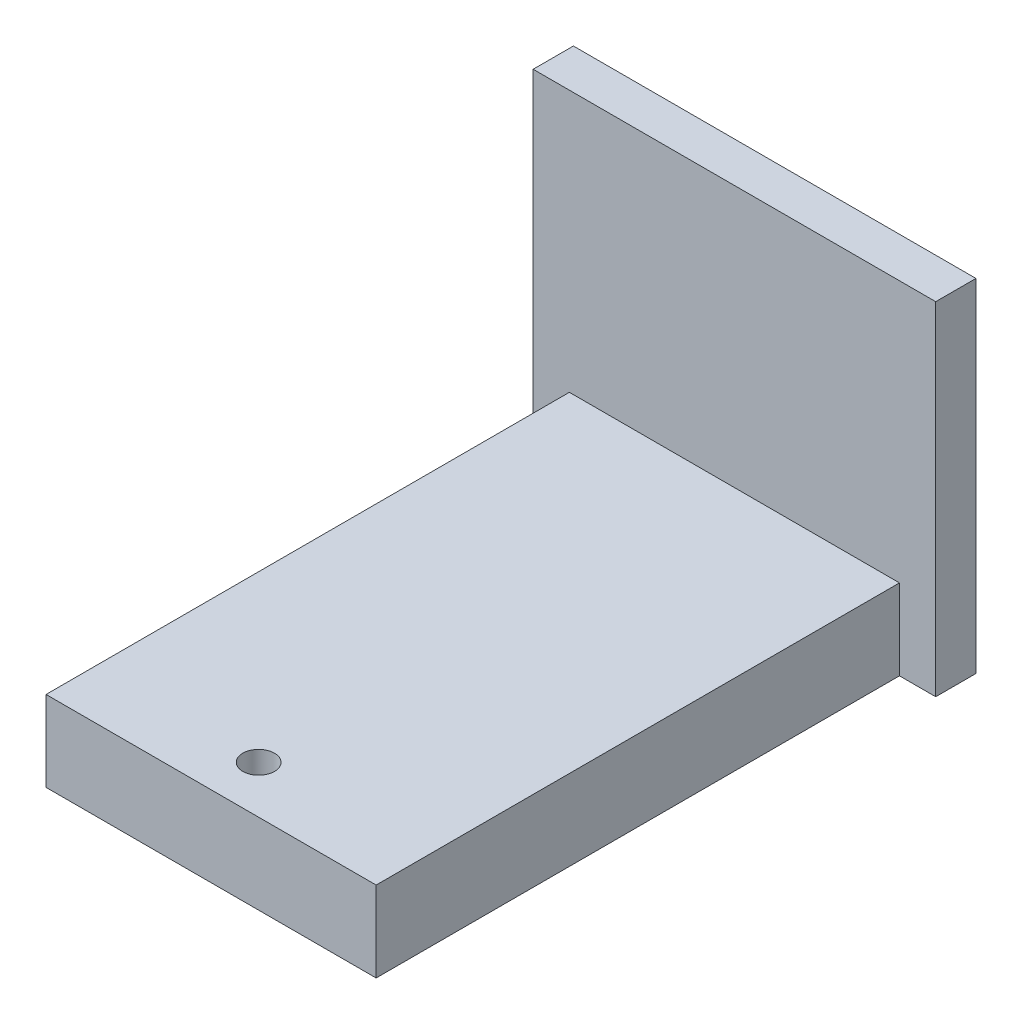
ISO-10303-21;
HEADER;
FILE_DESCRIPTION(('STEP AP214'),'2;1');
FILE_NAME('part.step','',(''),(''),'','','');
FILE_SCHEMA(('AUTOMOTIVE_DESIGN { 1 0 10303 214 1 1 1 1 }'));
ENDSEC;
DATA;
#1=APPLICATION_CONTEXT('core data for automotive mechanical design processes');
#2=APPLICATION_PROTOCOL_DEFINITION('international standard','automotive_design',2000,#1);
#3=PRODUCT_CONTEXT('',#1,'mechanical');
#4=PRODUCT('Part','Part','',(#3));
#5=PRODUCT_RELATED_PRODUCT_CATEGORY('part','',(#4));
#6=PRODUCT_DEFINITION_FORMATION('','',#4);
#7=PRODUCT_DEFINITION_CONTEXT('part definition',#1,'design');
#8=PRODUCT_DEFINITION('design','',#6,#7);
#9=PRODUCT_DEFINITION_SHAPE('','',#8);
#10=(LENGTH_UNIT() NAMED_UNIT(*) SI_UNIT(.MILLI.,.METRE.));
#11=(NAMED_UNIT(*) PLANE_ANGLE_UNIT() SI_UNIT($,.RADIAN.));
#12=(NAMED_UNIT(*) SI_UNIT($,.STERADIAN.) SOLID_ANGLE_UNIT());
#13=UNCERTAINTY_MEASURE_WITH_UNIT(LENGTH_MEASURE(1.E-05),#10,'distance_accuracy_value','');
#14=(GEOMETRIC_REPRESENTATION_CONTEXT(3) GLOBAL_UNCERTAINTY_ASSIGNED_CONTEXT((#13)) GLOBAL_UNIT_ASSIGNED_CONTEXT((#10,
#11,#12)) REPRESENTATION_CONTEXT('',''));
#15=CARTESIAN_POINT('',(0.,0.,0.));
#16=DIRECTION('',(0.,0.,1.));
#17=DIRECTION('',(1.,0.,0.));
#18=AXIS2_PLACEMENT_3D('',#15,#16,#17);
#19=CARTESIAN_POINT('',(0.,0.,2.54));
#20=DIRECTION('',(1.,0.,0.));
#21=DIRECTION('',(0.,1.,0.));
#22=AXIS2_PLACEMENT_3D('',#19,#20,#21);
#23=PLANE('',#22);
#24=DIRECTION('',(0.,-1.,0.));
#25=VECTOR('',#24,1.);
#26=CARTESIAN_POINT('',(0.,0.,0.));
#27=LINE('',#26,#25);
#28=CARTESIAN_POINT('',(0.,0.,0.));
#29=VERTEX_POINT('',#28);
#30=CARTESIAN_POINT('',(0.,-21.59,0.));
#31=VERTEX_POINT('',#30);
#32=EDGE_CURVE('E83',#29,#31,#27,.T.);
#33=ORIENTED_EDGE('',*,*,#32,.T.);
#34=DIRECTION('',(0.,0.,1.));
#35=VECTOR('',#34,1.);
#36=CARTESIAN_POINT('',(0.,-21.59,0.));
#37=LINE('',#36,#35);
#38=CARTESIAN_POINT('',(0.,-21.59,2.54));
#39=VERTEX_POINT('',#38);
#40=EDGE_CURVE('E49',#31,#39,#37,.T.);
#41=ORIENTED_EDGE('',*,*,#40,.T.);
#42=DIRECTION('',(0.,-1.,0.));
#43=VECTOR('',#42,1.);
#44=CARTESIAN_POINT('',(0.,0.,2.54));
#45=LINE('',#44,#43);
#46=CARTESIAN_POINT('',(0.,0.,2.54));
#47=VERTEX_POINT('',#46);
#48=EDGE_CURVE('E78',#47,#39,#45,.T.);
#49=ORIENTED_EDGE('',*,*,#48,.F.);
#50=DIRECTION('',(0.,0.,-1.));
#51=VECTOR('',#50,1.);
#52=CARTESIAN_POINT('',(0.,0.,2.54));
#53=LINE('',#52,#51);
#54=EDGE_CURVE('E42',#47,#29,#53,.T.);
#55=ORIENTED_EDGE('',*,*,#54,.T.);
#56=EDGE_LOOP('',(#33,#41,#49,#55));
#57=FACE_BOUND('',#56,.T.);
#58=ADVANCED_FACE('F35',(#57),#23,.F.);
#59=CARTESIAN_POINT('',(25.4,0.,2.54));
#60=DIRECTION('',(-1.,0.,0.));
#61=DIRECTION('',(0.,-1.,0.));
#62=AXIS2_PLACEMENT_3D('',#59,#60,#61);
#63=PLANE('',#62);
#64=DIRECTION('',(0.,1.,0.));
#65=VECTOR('',#64,1.);
#66=CARTESIAN_POINT('',(25.4,0.,2.54));
#67=LINE('',#66,#65);
#68=CARTESIAN_POINT('',(25.4,-21.59,2.54));
#69=VERTEX_POINT('',#68);
#70=CARTESIAN_POINT('',(25.4,0.,2.54));
#71=VERTEX_POINT('',#70);
#72=EDGE_CURVE('E94',#69,#71,#67,.T.);
#73=ORIENTED_EDGE('',*,*,#72,.F.);
#74=DIRECTION('',(0.,0.,1.));
#75=VECTOR('',#74,1.);
#76=CARTESIAN_POINT('',(25.4,-21.59,0.));
#77=LINE('',#76,#75);
#78=CARTESIAN_POINT('',(25.4,-21.59,0.));
#79=VERTEX_POINT('',#78);
#80=EDGE_CURVE('E130',#79,#69,#77,.T.);
#81=ORIENTED_EDGE('',*,*,#80,.F.);
#82=DIRECTION('',(0.,1.,0.));
#83=VECTOR('',#82,1.);
#84=CARTESIAN_POINT('',(25.4,0.,0.));
#85=LINE('',#84,#83);
#86=CARTESIAN_POINT('',(25.4,0.,0.));
#87=VERTEX_POINT('',#86);
#88=EDGE_CURVE('E79',#79,#87,#85,.T.);
#89=ORIENTED_EDGE('',*,*,#88,.T.);
#90=DIRECTION('',(0.,0.,-1.));
#91=VECTOR('',#90,1.);
#92=CARTESIAN_POINT('',(25.4,0.,2.54));
#93=LINE('',#92,#91);
#94=EDGE_CURVE('E11',#71,#87,#93,.T.);
#95=ORIENTED_EDGE('',*,*,#94,.F.);
#96=EDGE_LOOP('',(#73,#81,#89,#95));
#97=FACE_BOUND('',#96,.T.);
#98=ADVANCED_FACE('F187',(#97),#63,.F.);
#99=CARTESIAN_POINT('',(0.,0.,2.54));
#100=DIRECTION('',(0.,-1.,0.));
#101=DIRECTION('',(0.,0.,-1.));
#102=AXIS2_PLACEMENT_3D('',#99,#100,#101);
#103=PLANE('',#102);
#104=DIRECTION('',(-1.,0.,0.));
#105=VECTOR('',#104,1.);
#106=CARTESIAN_POINT('',(0.,0.,0.));
#107=LINE('',#106,#105);
#108=EDGE_CURVE('E70',#87,#29,#107,.T.);
#109=ORIENTED_EDGE('',*,*,#108,.T.);
#110=ORIENTED_EDGE('',*,*,#54,.F.);
#111=DIRECTION('',(-1.,0.,0.));
#112=VECTOR('',#111,1.);
#113=CARTESIAN_POINT('',(0.,0.,2.54));
#114=LINE('',#113,#112);
#115=EDGE_CURVE('E58',#71,#47,#114,.T.);
#116=ORIENTED_EDGE('',*,*,#115,.F.);
#117=ORIENTED_EDGE('',*,*,#94,.T.);
#118=EDGE_LOOP('',(#109,#110,#116,#117));
#119=FACE_BOUND('',#118,.T.);
#120=ADVANCED_FACE('F72',(#119),#103,.F.);
#121=CARTESIAN_POINT('',(0.,0.,2.54));
#122=DIRECTION('',(0.,0.,1.));
#123=DIRECTION('',(1.,0.,0.));
#124=AXIS2_PLACEMENT_3D('',#121,#122,#123);
#125=PLANE('',#124);
#126=DIRECTION('',(-1.,0.,0.));
#127=VECTOR('',#126,1.);
#128=CARTESIAN_POINT('',(0.,-21.59,2.54));
#129=LINE('',#128,#127);
#130=CARTESIAN_POINT('',(23.114,-21.59,2.54));
#131=VERTEX_POINT('',#130);
#132=EDGE_CURVE('E116',#69,#131,#129,.T.);
#133=ORIENTED_EDGE('',*,*,#132,.F.);
#134=ORIENTED_EDGE('',*,*,#72,.T.);
#135=ORIENTED_EDGE('',*,*,#115,.T.);
#136=ORIENTED_EDGE('',*,*,#48,.T.);
#137=CARTESIAN_POINT('',(2.286,-21.59,2.54));
#138=VERTEX_POINT('',#137);
#139=EDGE_CURVE('E129',#138,#39,#129,.T.);
#140=ORIENTED_EDGE('',*,*,#139,.F.);
#141=DIRECTION('',(0.,-1.,0.));
#142=VECTOR('',#141,1.);
#143=CARTESIAN_POINT('',(2.286,-16.51,2.54));
#144=LINE('',#143,#142);
#145=CARTESIAN_POINT('',(2.286,-16.51,2.54));
#146=VERTEX_POINT('',#145);
#147=EDGE_CURVE('E102',#146,#138,#144,.T.);
#148=ORIENTED_EDGE('',*,*,#147,.F.);
#149=DIRECTION('',(1.,0.,0.));
#150=VECTOR('',#149,1.);
#151=CARTESIAN_POINT('',(0.,-16.51,2.54));
#152=LINE('',#151,#150);
#153=CARTESIAN_POINT('',(23.114,-16.51,2.54));
#154=VERTEX_POINT('',#153);
#155=EDGE_CURVE('E105',#146,#154,#152,.T.);
#156=ORIENTED_EDGE('',*,*,#155,.T.);
#157=DIRECTION('',(0.,-1.,0.));
#158=VECTOR('',#157,1.);
#159=CARTESIAN_POINT('',(23.114,-16.51,2.54));
#160=LINE('',#159,#158);
#161=EDGE_CURVE('E99',#154,#131,#160,.T.);
#162=ORIENTED_EDGE('',*,*,#161,.T.);
#163=EDGE_LOOP('',(#133,#134,#135,#136,#140,#148,#156,#162));
#164=FACE_BOUND('',#163,.T.);
#165=ADVANCED_FACE('F163',(#164),#125,.T.);
#166=CARTESIAN_POINT('',(0.,0.,0.));
#167=DIRECTION('',(0.,0.,1.));
#168=DIRECTION('',(1.,0.,0.));
#169=AXIS2_PLACEMENT_3D('',#166,#167,#168);
#170=PLANE('',#169);
#171=ORIENTED_EDGE('',*,*,#88,.F.);
#172=DIRECTION('',(-1.,0.,0.));
#173=VECTOR('',#172,1.);
#174=CARTESIAN_POINT('',(0.,-21.59,0.));
#175=LINE('',#174,#173);
#176=EDGE_CURVE('E85',#79,#31,#175,.T.);
#177=ORIENTED_EDGE('',*,*,#176,.T.);
#178=ORIENTED_EDGE('',*,*,#32,.F.);
#179=ORIENTED_EDGE('',*,*,#108,.F.);
#180=EDGE_LOOP('',(#171,#177,#178,#179));
#181=FACE_BOUND('',#180,.T.);
#182=ADVANCED_FACE('F84',(#181),#170,.F.);
#183=CARTESIAN_POINT('',(2.286,-16.51,0.));
#184=DIRECTION('',(-1.,0.,0.));
#185=DIRECTION('',(0.,0.,1.));
#186=AXIS2_PLACEMENT_3D('',#183,#184,#185);
#187=PLANE('',#186);
#188=DIRECTION('',(0.,0.,-1.));
#189=VECTOR('',#188,1.);
#190=CARTESIAN_POINT('',(2.286,-21.59,0.));
#191=LINE('',#190,#189);
#192=CARTESIAN_POINT('',(2.286,-21.59,35.56));
#193=VERTEX_POINT('',#192);
#194=EDGE_CURVE('E113',#193,#138,#191,.T.);
#195=ORIENTED_EDGE('',*,*,#194,.F.);
#196=DIRECTION('',(0.,-1.,0.));
#197=VECTOR('',#196,1.);
#198=CARTESIAN_POINT('',(2.286,-16.51,35.56));
#199=LINE('',#198,#197);
#200=CARTESIAN_POINT('',(2.286,-16.51,35.56));
#201=VERTEX_POINT('',#200);
#202=EDGE_CURVE('E86',#201,#193,#199,.T.);
#203=ORIENTED_EDGE('',*,*,#202,.F.);
#204=DIRECTION('',(0.,0.,-1.));
#205=VECTOR('',#204,1.);
#206=CARTESIAN_POINT('',(2.286,-16.51,0.));
#207=LINE('',#206,#205);
#208=EDGE_CURVE('E109',#201,#146,#207,.T.);
#209=ORIENTED_EDGE('',*,*,#208,.T.);
#210=ORIENTED_EDGE('',*,*,#147,.T.);
#211=EDGE_LOOP('',(#195,#203,#209,#210));
#212=FACE_BOUND('',#211,.T.);
#213=ADVANCED_FACE('F159',(#212),#187,.T.);
#214=CARTESIAN_POINT('',(0.,-16.51,35.56));
#215=DIRECTION('',(0.,0.,-1.));
#216=DIRECTION('',(-1.,0.,0.));
#217=AXIS2_PLACEMENT_3D('',#214,#215,#216);
#218=PLANE('',#217);
#219=DIRECTION('',(1.,0.,0.));
#220=VECTOR('',#219,1.);
#221=CARTESIAN_POINT('',(0.,-21.59,35.56));
#222=LINE('',#221,#220);
#223=CARTESIAN_POINT('',(23.114,-21.59,35.56));
#224=VERTEX_POINT('',#223);
#225=EDGE_CURVE('E110',#193,#224,#222,.T.);
#226=ORIENTED_EDGE('',*,*,#225,.T.);
#227=DIRECTION('',(0.,-1.,0.));
#228=VECTOR('',#227,1.);
#229=CARTESIAN_POINT('',(23.114,-16.51,35.56));
#230=LINE('',#229,#228);
#231=CARTESIAN_POINT('',(23.114,-16.51,35.56));
#232=VERTEX_POINT('',#231);
#233=EDGE_CURVE('E90',#232,#224,#230,.T.);
#234=ORIENTED_EDGE('',*,*,#233,.F.);
#235=DIRECTION('',(1.,0.,0.));
#236=VECTOR('',#235,1.);
#237=CARTESIAN_POINT('',(0.,-16.51,35.56));
#238=LINE('',#237,#236);
#239=EDGE_CURVE('E122',#201,#232,#238,.T.);
#240=ORIENTED_EDGE('',*,*,#239,.F.);
#241=ORIENTED_EDGE('',*,*,#202,.T.);
#242=EDGE_LOOP('',(#226,#234,#240,#241));
#243=FACE_BOUND('',#242,.T.);
#244=ADVANCED_FACE('F192',(#243),#218,.F.);
#245=CARTESIAN_POINT('',(23.114,-16.51,0.));
#246=DIRECTION('',(1.,0.,0.));
#247=DIRECTION('',(0.,0.,-1.));
#248=AXIS2_PLACEMENT_3D('',#245,#246,#247);
#249=PLANE('',#248);
#250=DIRECTION('',(0.,0.,1.));
#251=VECTOR('',#250,1.);
#252=CARTESIAN_POINT('',(23.114,-21.59,0.));
#253=LINE('',#252,#251);
#254=EDGE_CURVE('E106',#131,#224,#253,.T.);
#255=ORIENTED_EDGE('',*,*,#254,.F.);
#256=ORIENTED_EDGE('',*,*,#161,.F.);
#257=DIRECTION('',(0.,0.,1.));
#258=VECTOR('',#257,1.);
#259=CARTESIAN_POINT('',(23.114,-16.51,0.));
#260=LINE('',#259,#258);
#261=EDGE_CURVE('E119',#154,#232,#260,.T.);
#262=ORIENTED_EDGE('',*,*,#261,.T.);
#263=ORIENTED_EDGE('',*,*,#233,.T.);
#264=EDGE_LOOP('',(#255,#256,#262,#263));
#265=FACE_BOUND('',#264,.T.);
#266=ADVANCED_FACE('F188',(#265),#249,.T.);
#267=CARTESIAN_POINT('',(0.,-16.51,0.));
#268=DIRECTION('',(0.,1.,0.));
#269=DIRECTION('',(0.,0.,1.));
#270=AXIS2_PLACEMENT_3D('',#267,#268,#269);
#271=PLANE('',#270);
#272=CARTESIAN_POINT('',(12.7,-16.51,32.56));
#273=DIRECTION('',(0.,1.,0.));
#274=DIRECTION('',(0.,0.,1.));
#275=AXIS2_PLACEMENT_3D('',#272,#273,#274);
#276=CIRCLE('',#275,1.);
#277=CARTESIAN_POINT('',(12.7,-16.51,33.56));
#278=VERTEX_POINT('',#277);
#279=EDGE_CURVE('E135',#278,#278,#276,.T.);
#280=ORIENTED_EDGE('',*,*,#279,.F.);
#281=EDGE_LOOP('',(#280));
#282=FACE_BOUND('',#281,.T.);
#283=ORIENTED_EDGE('',*,*,#208,.F.);
#284=ORIENTED_EDGE('',*,*,#239,.T.);
#285=ORIENTED_EDGE('',*,*,#261,.F.);
#286=ORIENTED_EDGE('',*,*,#155,.F.);
#287=EDGE_LOOP('',(#283,#284,#285,#286));
#288=FACE_BOUND('',#287,.T.);
#289=ADVANCED_FACE('F146',(#282,#288),#271,.T.);
#290=CARTESIAN_POINT('',(0.,-21.59,0.));
#291=DIRECTION('',(0.,1.,0.));
#292=DIRECTION('',(0.,0.,1.));
#293=AXIS2_PLACEMENT_3D('',#290,#291,#292);
#294=PLANE('',#293);
#295=CARTESIAN_POINT('',(12.7,-21.59,32.56));
#296=DIRECTION('',(0.,-1.,0.));
#297=DIRECTION('',(0.,0.,-1.));
#298=AXIS2_PLACEMENT_3D('',#295,#296,#297);
#299=CIRCLE('',#298,1.);
#300=CARTESIAN_POINT('',(12.7,-21.59,31.56));
#301=VERTEX_POINT('',#300);
#302=EDGE_CURVE('E138',#301,#301,#299,.T.);
#303=ORIENTED_EDGE('',*,*,#302,.F.);
#304=EDGE_LOOP('',(#303));
#305=FACE_BOUND('',#304,.T.);
#306=ORIENTED_EDGE('',*,*,#194,.T.);
#307=ORIENTED_EDGE('',*,*,#139,.T.);
#308=ORIENTED_EDGE('',*,*,#40,.F.);
#309=ORIENTED_EDGE('',*,*,#176,.F.);
#310=ORIENTED_EDGE('',*,*,#80,.T.);
#311=ORIENTED_EDGE('',*,*,#132,.T.);
#312=ORIENTED_EDGE('',*,*,#254,.T.);
#313=ORIENTED_EDGE('',*,*,#225,.F.);
#314=EDGE_LOOP('',(#306,#307,#308,#309,#310,#311,#312,#313));
#315=FACE_BOUND('',#314,.T.);
#316=ADVANCED_FACE('F144',(#305,#315),#294,.F.);
#317=CARTESIAN_POINT('',(12.7,0.,32.56));
#318=DIRECTION('',(0.,-1.,0.));
#319=DIRECTION('',(0.,0.,-1.));
#320=AXIS2_PLACEMENT_3D('',#317,#318,#319);
#321=CYLINDRICAL_SURFACE('',#320,1.);
#322=ORIENTED_EDGE('',*,*,#279,.T.);
#323=EDGE_LOOP('',(#322));
#324=FACE_BOUND('',#323,.T.);
#325=ORIENTED_EDGE('',*,*,#302,.T.);
#326=EDGE_LOOP('',(#325));
#327=FACE_BOUND('',#326,.T.);
#328=ADVANCED_FACE('F142',(#324,#327),#321,.F.);
#329=CLOSED_SHELL('',(#58,#98,#120,#165,#182,#213,#244,#266,#289,#316,#328));
#330=MANIFOLD_SOLID_BREP('B2',#329);
#331=ADVANCED_BREP_SHAPE_REPRESENTATION('',(#18,#330),#14);
#332=SHAPE_DEFINITION_REPRESENTATION(#9,#331);
ENDSEC;
END-ISO-10303-21;
